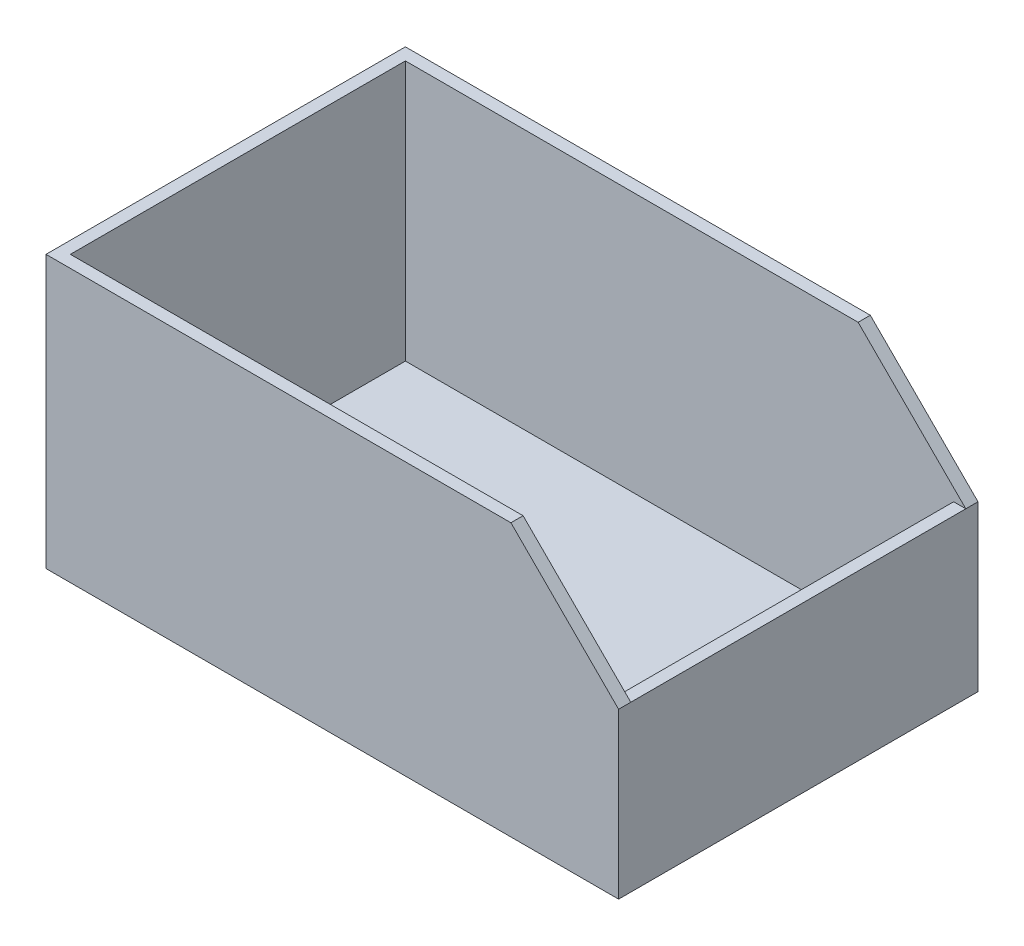
ISO-10303-21;
HEADER;
FILE_DESCRIPTION(('STEP AP214'),'2;1');
FILE_NAME('part.step','',(''),(''),'','','');
FILE_SCHEMA(('AUTOMOTIVE_DESIGN { 1 0 10303 214 1 1 1 1 }'));
ENDSEC;
DATA;
#1=APPLICATION_CONTEXT('core data for automotive mechanical design processes');
#2=APPLICATION_PROTOCOL_DEFINITION('international standard','automotive_design',2000,#1);
#3=PRODUCT_CONTEXT('',#1,'mechanical');
#4=PRODUCT('Part','Part','',(#3));
#5=PRODUCT_RELATED_PRODUCT_CATEGORY('part','',(#4));
#6=PRODUCT_DEFINITION_FORMATION('','',#4);
#7=PRODUCT_DEFINITION_CONTEXT('part definition',#1,'design');
#8=PRODUCT_DEFINITION('design','',#6,#7);
#9=PRODUCT_DEFINITION_SHAPE('','',#8);
#10=(LENGTH_UNIT() NAMED_UNIT(*) SI_UNIT(.MILLI.,.METRE.));
#11=(NAMED_UNIT(*) PLANE_ANGLE_UNIT() SI_UNIT($,.RADIAN.));
#12=(NAMED_UNIT(*) SI_UNIT($,.STERADIAN.) SOLID_ANGLE_UNIT());
#13=UNCERTAINTY_MEASURE_WITH_UNIT(LENGTH_MEASURE(1.E-05),#10,'distance_accuracy_value','');
#14=(GEOMETRIC_REPRESENTATION_CONTEXT(3) GLOBAL_UNCERTAINTY_ASSIGNED_CONTEXT((#13)) GLOBAL_UNIT_ASSIGNED_CONTEXT((#10,
#11,#12)) REPRESENTATION_CONTEXT('',''));
#15=CARTESIAN_POINT('',(0.,0.,0.));
#16=DIRECTION('',(0.,0.,1.));
#17=DIRECTION('',(1.,0.,0.));
#18=AXIS2_PLACEMENT_3D('',#15,#16,#17);
#19=CARTESIAN_POINT('',(0.,4.,0.));
#20=DIRECTION('',(0.,-1.,0.));
#21=DIRECTION('',(0.,0.,-1.));
#22=AXIS2_PLACEMENT_3D('',#19,#20,#21);
#23=PLANE('',#22);
#24=DIRECTION('',(0.,0.,-1.));
#25=VECTOR('',#24,1.);
#26=CARTESIAN_POINT('',(0.,4.,0.));
#27=LINE('',#26,#25);
#28=CARTESIAN_POINT('',(0.,4.,0.));
#29=VERTEX_POINT('',#28);
#30=CARTESIAN_POINT('',(0.,4.,-110.));
#31=VERTEX_POINT('',#30);
#32=EDGE_CURVE('E204',#29,#31,#27,.T.);
#33=ORIENTED_EDGE('',*,*,#32,.F.);
#34=DIRECTION('',(1.,0.,0.));
#35=VECTOR('',#34,1.);
#36=CARTESIAN_POINT('',(0.,4.,0.));
#37=LINE('',#36,#35);
#38=CARTESIAN_POINT('',(180.,4.,0.));
#39=VERTEX_POINT('',#38);
#40=EDGE_CURVE('E11',#29,#39,#37,.T.);
#41=ORIENTED_EDGE('',*,*,#40,.T.);
#42=DIRECTION('',(0.,0.,-1.));
#43=VECTOR('',#42,1.);
#44=CARTESIAN_POINT('',(180.,4.,0.));
#45=LINE('',#44,#43);
#46=CARTESIAN_POINT('',(180.,4.,-110.));
#47=VERTEX_POINT('',#46);
#48=EDGE_CURVE('E45',#39,#47,#45,.T.);
#49=ORIENTED_EDGE('',*,*,#48,.T.);
#50=DIRECTION('',(1.,0.,0.));
#51=VECTOR('',#50,1.);
#52=CARTESIAN_POINT('',(0.,4.,-110.));
#53=LINE('',#52,#51);
#54=EDGE_CURVE('E207',#31,#47,#53,.T.);
#55=ORIENTED_EDGE('',*,*,#54,.F.);
#56=EDGE_LOOP('',(#33,#41,#49,#55));
#57=FACE_BOUND('',#56,.T.);
#58=ADVANCED_FACE('F37',(#57),#23,.F.);
#59=CARTESIAN_POINT('',(0.,0.,0.));
#60=DIRECTION('',(0.,-1.,0.));
#61=DIRECTION('',(0.,0.,-1.));
#62=AXIS2_PLACEMENT_3D('',#59,#60,#61);
#63=PLANE('',#62);
#64=DIRECTION('',(0.,0.,-1.));
#65=VECTOR('',#64,1.);
#66=CARTESIAN_POINT('',(184.,0.,0.));
#67=LINE('',#66,#65);
#68=CARTESIAN_POINT('',(184.,0.,4.));
#69=VERTEX_POINT('',#68);
#70=CARTESIAN_POINT('',(184.,0.,-114.));
#71=VERTEX_POINT('',#70);
#72=EDGE_CURVE('E133',#69,#71,#67,.T.);
#73=ORIENTED_EDGE('',*,*,#72,.F.);
#74=DIRECTION('',(1.,0.,0.));
#75=VECTOR('',#74,1.);
#76=CARTESIAN_POINT('',(184.,0.,4.));
#77=LINE('',#76,#75);
#78=CARTESIAN_POINT('',(-4.,0.,4.));
#79=VERTEX_POINT('',#78);
#80=EDGE_CURVE('E132',#79,#69,#77,.T.);
#81=ORIENTED_EDGE('',*,*,#80,.F.);
#82=DIRECTION('',(0.,0.,1.));
#83=VECTOR('',#82,1.);
#84=CARTESIAN_POINT('',(-4.,0.,-114.));
#85=LINE('',#84,#83);
#86=CARTESIAN_POINT('',(-4.,0.,-114.));
#87=VERTEX_POINT('',#86);
#88=EDGE_CURVE('E119',#87,#79,#85,.T.);
#89=ORIENTED_EDGE('',*,*,#88,.F.);
#90=DIRECTION('',(-1.,0.,0.));
#91=VECTOR('',#90,1.);
#92=CARTESIAN_POINT('',(184.,0.,-114.));
#93=LINE('',#92,#91);
#94=EDGE_CURVE('E170',#71,#87,#93,.T.);
#95=ORIENTED_EDGE('',*,*,#94,.F.);
#96=EDGE_LOOP('',(#73,#81,#89,#95));
#97=FACE_BOUND('',#96,.T.);
#98=ADVANCED_FACE('F39',(#97),#63,.T.);
#99=CARTESIAN_POINT('',(184.,54.,0.));
#100=DIRECTION('',(0.,1.,0.));
#101=DIRECTION('',(0.,0.,1.));
#102=AXIS2_PLACEMENT_3D('',#99,#100,#101);
#103=PLANE('',#102);
#104=DIRECTION('',(0.,0.,-1.));
#105=VECTOR('',#104,1.);
#106=CARTESIAN_POINT('',(180.,54.,0.));
#107=LINE('',#106,#105);
#108=CARTESIAN_POINT('',(180.,54.,0.));
#109=VERTEX_POINT('',#108);
#110=CARTESIAN_POINT('',(180.,54.,-110.));
#111=VERTEX_POINT('',#110);
#112=EDGE_CURVE('E196',#109,#111,#107,.T.);
#113=ORIENTED_EDGE('',*,*,#112,.F.);
#114=DIRECTION('',(-1.,0.,0.));
#115=VECTOR('',#114,1.);
#116=CARTESIAN_POINT('',(184.,54.,0.));
#117=LINE('',#116,#115);
#118=CARTESIAN_POINT('',(184.,54.,0.));
#119=VERTEX_POINT('',#118);
#120=EDGE_CURVE('E194',#119,#109,#117,.T.);
#121=ORIENTED_EDGE('',*,*,#120,.F.);
#122=DIRECTION('',(0.,0.,-1.));
#123=VECTOR('',#122,1.);
#124=CARTESIAN_POINT('',(184.,54.,0.));
#125=LINE('',#124,#123);
#126=CARTESIAN_POINT('',(184.,54.,-110.));
#127=VERTEX_POINT('',#126);
#128=EDGE_CURVE('E190',#119,#127,#125,.T.);
#129=ORIENTED_EDGE('',*,*,#128,.T.);
#130=DIRECTION('',(-1.,0.,0.));
#131=VECTOR('',#130,1.);
#132=CARTESIAN_POINT('',(184.,54.,-110.));
#133=LINE('',#132,#131);
#134=EDGE_CURVE('E202',#127,#111,#133,.T.);
#135=ORIENTED_EDGE('',*,*,#134,.T.);
#136=EDGE_LOOP('',(#113,#121,#129,#135));
#137=FACE_BOUND('',#136,.T.);
#138=ADVANCED_FACE('F217',(#137),#103,.T.);
#139=CARTESIAN_POINT('',(184.,0.,0.));
#140=DIRECTION('',(1.,0.,0.));
#141=DIRECTION('',(0.,0.,-1.));
#142=AXIS2_PLACEMENT_3D('',#139,#140,#141);
#143=PLANE('',#142);
#144=ORIENTED_EDGE('',*,*,#72,.T.);
#145=DIRECTION('',(0.,-1.,0.));
#146=VECTOR('',#145,1.);
#147=CARTESIAN_POINT('',(184.,54.,-114.));
#148=LINE('',#147,#146);
#149=CARTESIAN_POINT('',(184.,54.,-114.));
#150=VERTEX_POINT('',#149);
#151=EDGE_CURVE('E167',#150,#71,#148,.T.);
#152=ORIENTED_EDGE('',*,*,#151,.F.);
#153=DIRECTION('',(0.,0.,1.));
#154=VECTOR('',#153,1.);
#155=CARTESIAN_POINT('',(184.,54.,-114.));
#156=LINE('',#155,#154);
#157=EDGE_CURVE('E177',#150,#127,#156,.T.);
#158=ORIENTED_EDGE('',*,*,#157,.T.);
#159=ORIENTED_EDGE('',*,*,#128,.F.);
#160=DIRECTION('',(0.,0.,-1.));
#161=VECTOR('',#160,1.);
#162=CARTESIAN_POINT('',(184.,54.,4.));
#163=LINE('',#162,#161);
#164=CARTESIAN_POINT('',(184.,54.,4.));
#165=VERTEX_POINT('',#164);
#166=EDGE_CURVE('E156',#165,#119,#163,.T.);
#167=ORIENTED_EDGE('',*,*,#166,.F.);
#168=DIRECTION('',(0.,1.,0.));
#169=VECTOR('',#168,1.);
#170=CARTESIAN_POINT('',(184.,54.,4.));
#171=LINE('',#170,#169);
#172=EDGE_CURVE('E136',#69,#165,#171,.T.);
#173=ORIENTED_EDGE('',*,*,#172,.F.);
#174=EDGE_LOOP('',(#144,#152,#158,#159,#167,#173));
#175=FACE_BOUND('',#174,.T.);
#176=ADVANCED_FACE('F228',(#175),#143,.T.);
#177=CARTESIAN_POINT('',(180.,0.,0.));
#178=DIRECTION('',(1.,0.,0.));
#179=DIRECTION('',(0.,0.,-1.));
#180=AXIS2_PLACEMENT_3D('',#177,#178,#179);
#181=PLANE('',#180);
#182=ORIENTED_EDGE('',*,*,#48,.F.);
#183=DIRECTION('',(0.,1.,0.));
#184=VECTOR('',#183,1.);
#185=CARTESIAN_POINT('',(180.,0.,0.));
#186=LINE('',#185,#184);
#187=EDGE_CURVE('E191',#39,#109,#186,.T.);
#188=ORIENTED_EDGE('',*,*,#187,.T.);
#189=ORIENTED_EDGE('',*,*,#112,.T.);
#190=DIRECTION('',(0.,1.,0.));
#191=VECTOR('',#190,1.);
#192=CARTESIAN_POINT('',(180.,0.,-110.));
#193=LINE('',#192,#191);
#194=EDGE_CURVE('E58',#47,#111,#193,.T.);
#195=ORIENTED_EDGE('',*,*,#194,.F.);
#196=EDGE_LOOP('',(#182,#188,#189,#195));
#197=FACE_BOUND('',#196,.T.);
#198=ADVANCED_FACE('F213',(#197),#181,.F.);
#199=CARTESIAN_POINT('',(0.,0.,-110.));
#200=DIRECTION('',(0.,0.,-1.));
#201=DIRECTION('',(-1.,0.,0.));
#202=AXIS2_PLACEMENT_3D('',#199,#200,#201);
#203=PLANE('',#202);
#204=DIRECTION('',(0.,1.,0.));
#205=VECTOR('',#204,1.);
#206=CARTESIAN_POINT('',(0.,89.3553390593273,-110.));
#207=LINE('',#206,#205);
#208=CARTESIAN_POINT('',(0.,89.3553390593273,-110.));
#209=VERTEX_POINT('',#208);
#210=EDGE_CURVE('E162',#31,#209,#207,.T.);
#211=ORIENTED_EDGE('',*,*,#210,.F.);
#212=ORIENTED_EDGE('',*,*,#54,.T.);
#213=ORIENTED_EDGE('',*,*,#194,.T.);
#214=ORIENTED_EDGE('',*,*,#134,.F.);
#215=DIRECTION('',(0.707106781186549,-0.707106781186546,0.));
#216=VECTOR('',#215,1.);
#217=CARTESIAN_POINT('',(184.,54.,-110.));
#218=LINE('',#217,#216);
#219=CARTESIAN_POINT('',(148.644660940673,89.3553390593273,-110.));
#220=VERTEX_POINT('',#219);
#221=EDGE_CURVE('E171',#220,#127,#218,.T.);
#222=ORIENTED_EDGE('',*,*,#221,.F.);
#223=DIRECTION('',(1.,0.,0.));
#224=VECTOR('',#223,1.);
#225=CARTESIAN_POINT('',(148.644660940673,89.3553390593273,-110.));
#226=LINE('',#225,#224);
#227=EDGE_CURVE('E180',#209,#220,#226,.T.);
#228=ORIENTED_EDGE('',*,*,#227,.F.);
#229=EDGE_LOOP('',(#211,#212,#213,#214,#222,#228));
#230=FACE_BOUND('',#229,.T.);
#231=ADVANCED_FACE('F220',(#230),#203,.F.);
#232=CARTESIAN_POINT('',(148.644660940673,89.3553390593273,-114.));
#233=DIRECTION('',(0.,-1.,0.));
#234=DIRECTION('',(0.,0.,-1.));
#235=AXIS2_PLACEMENT_3D('',#232,#233,#234);
#236=PLANE('',#235);
#237=ORIENTED_EDGE('',*,*,#227,.T.);
#238=DIRECTION('',(0.,0.,1.));
#239=VECTOR('',#238,1.);
#240=CARTESIAN_POINT('',(148.644660940673,89.3553390593273,-114.));
#241=LINE('',#240,#239);
#242=CARTESIAN_POINT('',(148.644660940673,89.3553390593273,-114.));
#243=VERTEX_POINT('',#242);
#244=EDGE_CURVE('E186',#243,#220,#241,.T.);
#245=ORIENTED_EDGE('',*,*,#244,.F.);
#246=DIRECTION('',(1.,0.,0.));
#247=VECTOR('',#246,1.);
#248=CARTESIAN_POINT('',(148.644660940673,89.3553390593273,-114.));
#249=LINE('',#248,#247);
#250=CARTESIAN_POINT('',(-4.,89.3553390593273,-114.));
#251=VERTEX_POINT('',#250);
#252=EDGE_CURVE('E173',#251,#243,#249,.T.);
#253=ORIENTED_EDGE('',*,*,#252,.F.);
#254=DIRECTION('',(0.,0.,1.));
#255=VECTOR('',#254,1.);
#256=CARTESIAN_POINT('',(-4.,89.3553390593273,-114.));
#257=LINE('',#256,#255);
#258=CARTESIAN_POINT('',(-4.,89.3553390593273,4.));
#259=VERTEX_POINT('',#258);
#260=EDGE_CURVE('E129',#251,#259,#257,.T.);
#261=ORIENTED_EDGE('',*,*,#260,.T.);
#262=DIRECTION('',(-1.,0.,0.));
#263=VECTOR('',#262,1.);
#264=CARTESIAN_POINT('',(-4.,89.3553390593273,4.));
#265=LINE('',#264,#263);
#266=CARTESIAN_POINT('',(148.644660940673,89.3553390593273,4.));
#267=VERTEX_POINT('',#266);
#268=EDGE_CURVE('E141',#267,#259,#265,.T.);
#269=ORIENTED_EDGE('',*,*,#268,.F.);
#270=DIRECTION('',(0.,0.,-1.));
#271=VECTOR('',#270,1.);
#272=CARTESIAN_POINT('',(148.644660940673,89.3553390593273,4.));
#273=LINE('',#272,#271);
#274=CARTESIAN_POINT('',(148.644660940673,89.3553390593273,0.));
#275=VERTEX_POINT('',#274);
#276=EDGE_CURVE('E152',#267,#275,#273,.T.);
#277=ORIENTED_EDGE('',*,*,#276,.T.);
#278=DIRECTION('',(-1.,0.,0.));
#279=VECTOR('',#278,1.);
#280=CARTESIAN_POINT('',(-4.,89.3553390593273,0.));
#281=LINE('',#280,#279);
#282=CARTESIAN_POINT('',(0.,89.3553390593273,0.));
#283=VERTEX_POINT('',#282);
#284=EDGE_CURVE('E142',#275,#283,#281,.T.);
#285=ORIENTED_EDGE('',*,*,#284,.T.);
#286=DIRECTION('',(0.,0.,1.));
#287=VECTOR('',#286,1.);
#288=CARTESIAN_POINT('',(0.,89.3553390593273,-114.));
#289=LINE('',#288,#287);
#290=EDGE_CURVE('E159',#209,#283,#289,.T.);
#291=ORIENTED_EDGE('',*,*,#290,.F.);
#292=EDGE_LOOP('',(#237,#245,#253,#261,#269,#277,#285,#291));
#293=FACE_BOUND('',#292,.T.);
#294=ADVANCED_FACE('F233',(#293),#236,.F.);
#295=CARTESIAN_POINT('',(184.,54.,-114.));
#296=DIRECTION('',(-0.707106781186546,-0.707106781186549,0.));
#297=DIRECTION('',(0.707106781186549,-0.707106781186546,0.));
#298=AXIS2_PLACEMENT_3D('',#295,#296,#297);
#299=PLANE('',#298);
#300=ORIENTED_EDGE('',*,*,#221,.T.);
#301=ORIENTED_EDGE('',*,*,#157,.F.);
#302=DIRECTION('',(0.707106781186549,-0.707106781186546,0.));
#303=VECTOR('',#302,1.);
#304=CARTESIAN_POINT('',(184.,54.,-114.));
#305=LINE('',#304,#303);
#306=EDGE_CURVE('E175',#243,#150,#305,.T.);
#307=ORIENTED_EDGE('',*,*,#306,.F.);
#308=ORIENTED_EDGE('',*,*,#244,.T.);
#309=EDGE_LOOP('',(#300,#301,#307,#308));
#310=FACE_BOUND('',#309,.T.);
#311=ADVANCED_FACE('F223',(#310),#299,.F.);
#312=CARTESIAN_POINT('',(0.,0.,-114.));
#313=DIRECTION('',(0.,0.,-1.));
#314=DIRECTION('',(-1.,0.,0.));
#315=AXIS2_PLACEMENT_3D('',#312,#313,#314);
#316=PLANE('',#315);
#317=ORIENTED_EDGE('',*,*,#151,.T.);
#318=ORIENTED_EDGE('',*,*,#94,.T.);
#319=DIRECTION('',(0.,-1.,0.));
#320=VECTOR('',#319,1.);
#321=CARTESIAN_POINT('',(-4.,89.3553390593273,-114.));
#322=LINE('',#321,#320);
#323=EDGE_CURVE('E126',#251,#87,#322,.T.);
#324=ORIENTED_EDGE('',*,*,#323,.F.);
#325=ORIENTED_EDGE('',*,*,#252,.T.);
#326=ORIENTED_EDGE('',*,*,#306,.T.);
#327=EDGE_LOOP('',(#317,#318,#324,#325,#326));
#328=FACE_BOUND('',#327,.T.);
#329=ADVANCED_FACE('F231',(#328),#316,.T.);
#330=CARTESIAN_POINT('',(0.,0.,0.));
#331=DIRECTION('',(-1.,0.,0.));
#332=DIRECTION('',(0.,0.,1.));
#333=AXIS2_PLACEMENT_3D('',#330,#331,#332);
#334=PLANE('',#333);
#335=DIRECTION('',(0.,-1.,0.));
#336=VECTOR('',#335,1.);
#337=CARTESIAN_POINT('',(0.,89.3553390593273,0.));
#338=LINE('',#337,#336);
#339=EDGE_CURVE('E158',#283,#29,#338,.T.);
#340=ORIENTED_EDGE('',*,*,#339,.T.);
#341=ORIENTED_EDGE('',*,*,#32,.T.);
#342=ORIENTED_EDGE('',*,*,#210,.T.);
#343=ORIENTED_EDGE('',*,*,#290,.T.);
#344=EDGE_LOOP('',(#340,#341,#342,#343));
#345=FACE_BOUND('',#344,.T.);
#346=ADVANCED_FACE('F236',(#345),#334,.F.);
#347=CARTESIAN_POINT('',(-4.,0.,0.));
#348=DIRECTION('',(-1.,0.,0.));
#349=DIRECTION('',(0.,0.,1.));
#350=AXIS2_PLACEMENT_3D('',#347,#348,#349);
#351=PLANE('',#350);
#352=ORIENTED_EDGE('',*,*,#323,.T.);
#353=ORIENTED_EDGE('',*,*,#88,.T.);
#354=DIRECTION('',(0.,-1.,0.));
#355=VECTOR('',#354,1.);
#356=CARTESIAN_POINT('',(-4.,0.,4.));
#357=LINE('',#356,#355);
#358=EDGE_CURVE('E124',#259,#79,#357,.T.);
#359=ORIENTED_EDGE('',*,*,#358,.F.);
#360=ORIENTED_EDGE('',*,*,#260,.F.);
#361=EDGE_LOOP('',(#352,#353,#359,#360));
#362=FACE_BOUND('',#361,.T.);
#363=ADVANCED_FACE('F121',(#362),#351,.T.);
#364=CARTESIAN_POINT('',(148.644660940673,89.3553390593273,4.));
#365=DIRECTION('',(-0.707106781186546,-0.707106781186549,0.));
#366=DIRECTION('',(0.707106781186549,-0.707106781186546,0.));
#367=AXIS2_PLACEMENT_3D('',#364,#365,#366);
#368=PLANE('',#367);
#369=DIRECTION('',(-0.707106781186549,0.707106781186546,0.));
#370=VECTOR('',#369,1.);
#371=CARTESIAN_POINT('',(148.644660940673,89.3553390593273,0.));
#372=LINE('',#371,#370);
#373=EDGE_CURVE('E145',#119,#275,#372,.T.);
#374=ORIENTED_EDGE('',*,*,#373,.T.);
#375=ORIENTED_EDGE('',*,*,#276,.F.);
#376=DIRECTION('',(-0.707106781186549,0.707106781186546,0.));
#377=VECTOR('',#376,1.);
#378=CARTESIAN_POINT('',(148.644660940673,89.3553390593273,4.));
#379=LINE('',#378,#377);
#380=EDGE_CURVE('E149',#165,#267,#379,.T.);
#381=ORIENTED_EDGE('',*,*,#380,.F.);
#382=ORIENTED_EDGE('',*,*,#166,.T.);
#383=EDGE_LOOP('',(#374,#375,#381,#382));
#384=FACE_BOUND('',#383,.T.);
#385=ADVANCED_FACE('F243',(#384),#368,.F.);
#386=CARTESIAN_POINT('',(0.,0.,4.));
#387=DIRECTION('',(0.,0.,-1.));
#388=DIRECTION('',(-1.,0.,0.));
#389=AXIS2_PLACEMENT_3D('',#386,#387,#388);
#390=PLANE('',#389);
#391=ORIENTED_EDGE('',*,*,#358,.T.);
#392=ORIENTED_EDGE('',*,*,#80,.T.);
#393=ORIENTED_EDGE('',*,*,#172,.T.);
#394=ORIENTED_EDGE('',*,*,#380,.T.);
#395=ORIENTED_EDGE('',*,*,#268,.T.);
#396=EDGE_LOOP('',(#391,#392,#393,#394,#395));
#397=FACE_BOUND('',#396,.T.);
#398=ADVANCED_FACE('F139',(#397),#390,.F.);
#399=CARTESIAN_POINT('',(0.,0.,0.));
#400=DIRECTION('',(0.,0.,-1.));
#401=DIRECTION('',(-1.,0.,0.));
#402=AXIS2_PLACEMENT_3D('',#399,#400,#401);
#403=PLANE('',#402);
#404=ORIENTED_EDGE('',*,*,#373,.F.);
#405=ORIENTED_EDGE('',*,*,#120,.T.);
#406=ORIENTED_EDGE('',*,*,#187,.F.);
#407=ORIENTED_EDGE('',*,*,#40,.F.);
#408=ORIENTED_EDGE('',*,*,#339,.F.);
#409=ORIENTED_EDGE('',*,*,#284,.F.);
#410=EDGE_LOOP('',(#404,#405,#406,#407,#408,#409));
#411=FACE_BOUND('',#410,.T.);
#412=ADVANCED_FACE('F239',(#411),#403,.T.);
#413=CLOSED_SHELL('',(#58,#98,#138,#176,#198,#231,#294,#311,#329,#346,#363,#385,#398,#412));
#414=MANIFOLD_SOLID_BREP('B2',#413);
#415=ADVANCED_BREP_SHAPE_REPRESENTATION('',(#18,#414),#14);
#416=SHAPE_DEFINITION_REPRESENTATION(#9,#415);
ENDSEC;
END-ISO-10303-21;
